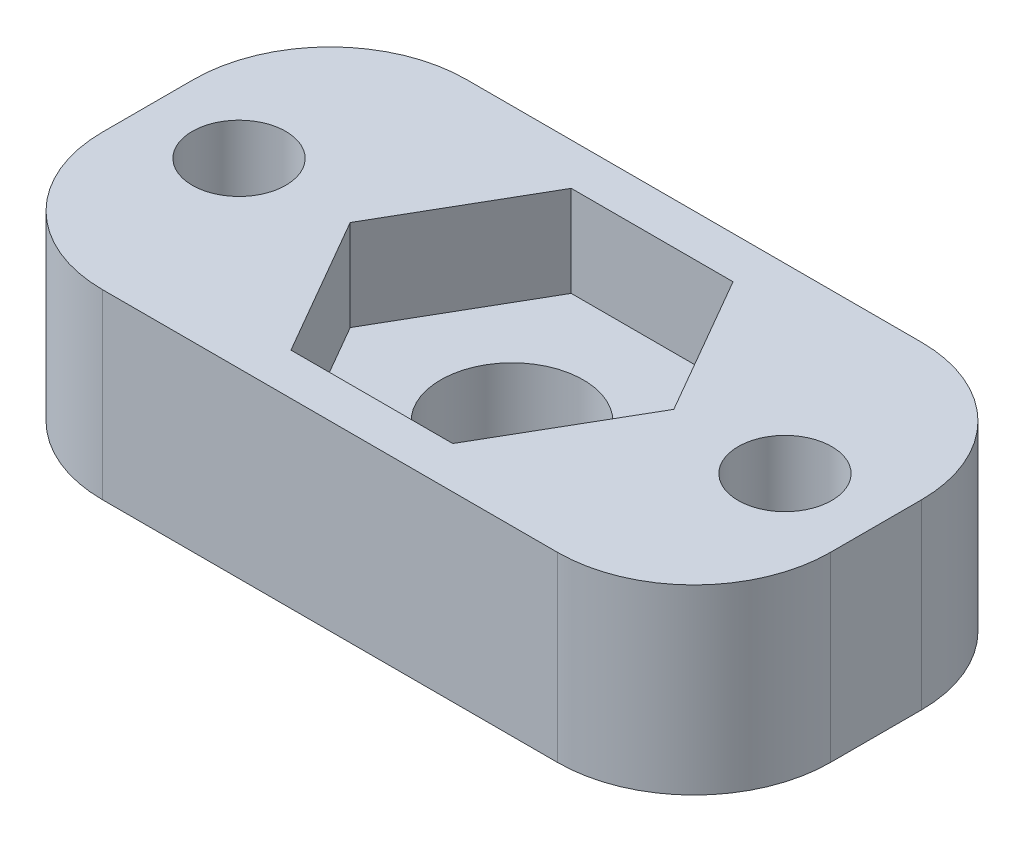
ISO-10303-21;
HEADER;
FILE_DESCRIPTION(('STEP AP214'),'2;1');
FILE_NAME('part.step','',(''),(''),'','','');
FILE_SCHEMA(('AUTOMOTIVE_DESIGN { 1 0 10303 214 1 1 1 1 }'));
ENDSEC;
DATA;
#1=APPLICATION_CONTEXT('core data for automotive mechanical design processes');
#2=APPLICATION_PROTOCOL_DEFINITION('international standard','automotive_design',2000,#1);
#3=PRODUCT_CONTEXT('',#1,'mechanical');
#4=PRODUCT('Part','Part','',(#3));
#5=PRODUCT_RELATED_PRODUCT_CATEGORY('part','',(#4));
#6=PRODUCT_DEFINITION_FORMATION('','',#4);
#7=PRODUCT_DEFINITION_CONTEXT('part definition',#1,'design');
#8=PRODUCT_DEFINITION('design','',#6,#7);
#9=PRODUCT_DEFINITION_SHAPE('','',#8);
#10=(LENGTH_UNIT() NAMED_UNIT(*) SI_UNIT(.MILLI.,.METRE.));
#11=(NAMED_UNIT(*) PLANE_ANGLE_UNIT() SI_UNIT($,.RADIAN.));
#12=(NAMED_UNIT(*) SI_UNIT($,.STERADIAN.) SOLID_ANGLE_UNIT());
#13=UNCERTAINTY_MEASURE_WITH_UNIT(LENGTH_MEASURE(1.E-05),#10,'distance_accuracy_value','');
#14=(GEOMETRIC_REPRESENTATION_CONTEXT(3) GLOBAL_UNCERTAINTY_ASSIGNED_CONTEXT((#13)) GLOBAL_UNIT_ASSIGNED_CONTEXT((#10,
#11,#12)) REPRESENTATION_CONTEXT('',''));
#15=CARTESIAN_POINT('',(0.,0.,0.));
#16=DIRECTION('',(0.,0.,1.));
#17=DIRECTION('',(1.,0.,0.));
#18=AXIS2_PLACEMENT_3D('',#15,#16,#17);
#19=CARTESIAN_POINT('',(12.7,3.175,0.));
#20=DIRECTION('',(1.,0.,0.));
#21=DIRECTION('',(0.,0.,-1.));
#22=AXIS2_PLACEMENT_3D('',#19,#20,#21);
#23=PLANE('',#22);
#24=DIRECTION('',(0.,0.,1.));
#25=VECTOR('',#24,1.);
#26=CARTESIAN_POINT('',(12.7,0.,0.));
#27=LINE('',#26,#25);
#28=CARTESIAN_POINT('',(12.7,0.,-1.5875));
#29=VERTEX_POINT('',#28);
#30=CARTESIAN_POINT('',(12.7,0.,1.5875));
#31=VERTEX_POINT('',#30);
#32=EDGE_CURVE('E240',#29,#31,#27,.T.);
#33=ORIENTED_EDGE('',*,*,#32,.F.);
#34=DIRECTION('',(0.,-1.,0.));
#35=VECTOR('',#34,1.);
#36=CARTESIAN_POINT('',(12.7,3.175,-1.5875));
#37=LINE('',#36,#35);
#38=CARTESIAN_POINT('',(12.7,6.35,-1.5875));
#39=VERTEX_POINT('',#38);
#40=EDGE_CURVE('E294',#29,#39,#37,.F.);
#41=ORIENTED_EDGE('',*,*,#40,.T.);
#42=DIRECTION('',(0.,0.,1.));
#43=VECTOR('',#42,1.);
#44=CARTESIAN_POINT('',(12.7,6.35,0.));
#45=LINE('',#44,#43);
#46=CARTESIAN_POINT('',(12.7,6.35,1.5875));
#47=VERTEX_POINT('',#46);
#48=EDGE_CURVE('E184',#39,#47,#45,.T.);
#49=ORIENTED_EDGE('',*,*,#48,.T.);
#50=DIRECTION('',(0.,-1.,0.));
#51=VECTOR('',#50,1.);
#52=CARTESIAN_POINT('',(12.7,0.,1.5875));
#53=LINE('',#52,#51);
#54=EDGE_CURVE('E290',#47,#31,#53,.T.);
#55=ORIENTED_EDGE('',*,*,#54,.T.);
#56=EDGE_LOOP('',(#33,#41,#49,#55));
#57=FACE_BOUND('',#56,.T.);
#58=ADVANCED_FACE('F43',(#57),#23,.T.);
#59=CARTESIAN_POINT('',(0.,3.175,-6.35));
#60=DIRECTION('',(0.,0.,-1.));
#61=DIRECTION('',(-1.,0.,0.));
#62=AXIS2_PLACEMENT_3D('',#59,#60,#61);
#63=PLANE('',#62);
#64=DIRECTION('',(1.,0.,0.));
#65=VECTOR('',#64,1.);
#66=CARTESIAN_POINT('',(0.,6.35,-6.35));
#67=LINE('',#66,#65);
#68=CARTESIAN_POINT('',(-7.9375,6.35,-6.35));
#69=VERTEX_POINT('',#68);
#70=CARTESIAN_POINT('',(7.9375,6.35,-6.35));
#71=VERTEX_POINT('',#70);
#72=EDGE_CURVE('E189',#69,#71,#67,.T.);
#73=ORIENTED_EDGE('',*,*,#72,.T.);
#74=DIRECTION('',(0.,-1.,0.));
#75=VECTOR('',#74,1.);
#76=CARTESIAN_POINT('',(7.9375,3.175,-6.35));
#77=LINE('',#76,#75);
#78=CARTESIAN_POINT('',(7.9375,0.,-6.35));
#79=VERTEX_POINT('',#78);
#80=EDGE_CURVE('E274',#71,#79,#77,.T.);
#81=ORIENTED_EDGE('',*,*,#80,.T.);
#82=DIRECTION('',(1.,0.,0.));
#83=VECTOR('',#82,1.);
#84=CARTESIAN_POINT('',(0.,0.,-6.35));
#85=LINE('',#84,#83);
#86=CARTESIAN_POINT('',(-7.9375,0.,-6.35));
#87=VERTEX_POINT('',#86);
#88=EDGE_CURVE('E250',#87,#79,#85,.T.);
#89=ORIENTED_EDGE('',*,*,#88,.F.);
#90=DIRECTION('',(0.,-1.,0.));
#91=VECTOR('',#90,1.);
#92=CARTESIAN_POINT('',(-7.9375,6.35,-6.35));
#93=LINE('',#92,#91);
#94=EDGE_CURVE('E245',#87,#69,#93,.F.);
#95=ORIENTED_EDGE('',*,*,#94,.T.);
#96=EDGE_LOOP('',(#73,#81,#89,#95));
#97=FACE_BOUND('',#96,.T.);
#98=ADVANCED_FACE('F361',(#97),#63,.T.);
#99=CARTESIAN_POINT('',(-12.7,3.175,0.));
#100=DIRECTION('',(1.,0.,0.));
#101=DIRECTION('',(0.,0.,-1.));
#102=AXIS2_PLACEMENT_3D('',#99,#100,#101);
#103=PLANE('',#102);
#104=DIRECTION('',(0.,0.,1.));
#105=VECTOR('',#104,1.);
#106=CARTESIAN_POINT('',(-12.7,6.35,0.));
#107=LINE('',#106,#105);
#108=CARTESIAN_POINT('',(-12.7,6.35,-1.5875));
#109=VERTEX_POINT('',#108);
#110=CARTESIAN_POINT('',(-12.7,6.35,1.5875));
#111=VERTEX_POINT('',#110);
#112=EDGE_CURVE('E170',#109,#111,#107,.T.);
#113=ORIENTED_EDGE('',*,*,#112,.F.);
#114=DIRECTION('',(0.,-1.,0.));
#115=VECTOR('',#114,1.);
#116=CARTESIAN_POINT('',(-12.7,0.,-1.5875));
#117=LINE('',#116,#115);
#118=CARTESIAN_POINT('',(-12.7,0.,-1.5875));
#119=VERTEX_POINT('',#118);
#120=EDGE_CURVE('E12',#109,#119,#117,.T.);
#121=ORIENTED_EDGE('',*,*,#120,.T.);
#122=DIRECTION('',(0.,0.,1.));
#123=VECTOR('',#122,1.);
#124=CARTESIAN_POINT('',(-12.7,0.,0.));
#125=LINE('',#124,#123);
#126=CARTESIAN_POINT('',(-12.7,0.,1.5875));
#127=VERTEX_POINT('',#126);
#128=EDGE_CURVE('E254',#119,#127,#125,.T.);
#129=ORIENTED_EDGE('',*,*,#128,.T.);
#130=DIRECTION('',(0.,-1.,0.));
#131=VECTOR('',#130,1.);
#132=CARTESIAN_POINT('',(-12.7,3.175,1.5875));
#133=LINE('',#132,#131);
#134=EDGE_CURVE('E52',#127,#111,#133,.F.);
#135=ORIENTED_EDGE('',*,*,#134,.T.);
#136=EDGE_LOOP('',(#113,#121,#129,#135));
#137=FACE_BOUND('',#136,.T.);
#138=ADVANCED_FACE('F317',(#137),#103,.F.);
#139=CARTESIAN_POINT('',(-9.525,3.175,0.));
#140=DIRECTION('',(0.,-1.,0.));
#141=DIRECTION('',(0.,0.,-1.));
#142=AXIS2_PLACEMENT_3D('',#139,#140,#141);
#143=CYLINDRICAL_SURFACE('',#142,1.63195);
#144=CARTESIAN_POINT('',(-9.525,0.,0.));
#145=DIRECTION('',(0.,1.,0.));
#146=DIRECTION('',(0.,0.,1.));
#147=AXIS2_PLACEMENT_3D('',#144,#145,#146);
#148=CIRCLE('',#147,1.63195);
#149=CARTESIAN_POINT('',(-9.525,0.,1.63195));
#150=VERTEX_POINT('',#149);
#151=EDGE_CURVE('E265',#150,#150,#148,.F.);
#152=ORIENTED_EDGE('',*,*,#151,.T.);
#153=EDGE_LOOP('',(#152));
#154=FACE_BOUND('',#153,.T.);
#155=CARTESIAN_POINT('',(-9.525,6.35,0.));
#156=DIRECTION('',(0.,1.,0.));
#157=DIRECTION('',(0.,0.,1.));
#158=AXIS2_PLACEMENT_3D('',#155,#156,#157);
#159=CIRCLE('',#158,1.63195);
#160=CARTESIAN_POINT('',(-9.525,6.35,1.63195));
#161=VERTEX_POINT('',#160);
#162=EDGE_CURVE('E205',#161,#161,#159,.F.);
#163=ORIENTED_EDGE('',*,*,#162,.F.);
#164=EDGE_LOOP('',(#163));
#165=FACE_BOUND('',#164,.T.);
#166=ADVANCED_FACE('F350',(#154,#165),#143,.F.);
#167=CARTESIAN_POINT('',(9.525,3.175,0.));
#168=DIRECTION('',(0.,-1.,0.));
#169=DIRECTION('',(0.,0.,-1.));
#170=AXIS2_PLACEMENT_3D('',#167,#168,#169);
#171=CYLINDRICAL_SURFACE('',#170,1.63195);
#172=CARTESIAN_POINT('',(9.525,0.,0.));
#173=DIRECTION('',(0.,1.,0.));
#174=DIRECTION('',(0.,0.,1.));
#175=AXIS2_PLACEMENT_3D('',#172,#173,#174);
#176=CIRCLE('',#175,1.63195);
#177=CARTESIAN_POINT('',(9.525,0.,1.63195));
#178=VERTEX_POINT('',#177);
#179=EDGE_CURVE('E261',#178,#178,#176,.T.);
#180=ORIENTED_EDGE('',*,*,#179,.F.);
#181=EDGE_LOOP('',(#180));
#182=FACE_BOUND('',#181,.T.);
#183=CARTESIAN_POINT('',(9.525,6.35,0.));
#184=DIRECTION('',(0.,1.,0.));
#185=DIRECTION('',(0.,0.,1.));
#186=AXIS2_PLACEMENT_3D('',#183,#184,#185);
#187=CIRCLE('',#186,1.63195);
#188=CARTESIAN_POINT('',(9.525,6.35,1.63195));
#189=VERTEX_POINT('',#188);
#190=EDGE_CURVE('E177',#189,#189,#187,.T.);
#191=ORIENTED_EDGE('',*,*,#190,.T.);
#192=EDGE_LOOP('',(#191));
#193=FACE_BOUND('',#192,.T.);
#194=ADVANCED_FACE('F352',(#182,#193),#171,.F.);
#195=CARTESIAN_POINT('',(0.,3.175,6.35));
#196=DIRECTION('',(0.,0.,-1.));
#197=DIRECTION('',(-1.,0.,0.));
#198=AXIS2_PLACEMENT_3D('',#195,#196,#197);
#199=PLANE('',#198);
#200=DIRECTION('',(1.,0.,0.));
#201=VECTOR('',#200,1.);
#202=CARTESIAN_POINT('',(0.,0.,6.35));
#203=LINE('',#202,#201);
#204=CARTESIAN_POINT('',(-7.9375,0.,6.35));
#205=VERTEX_POINT('',#204);
#206=CARTESIAN_POINT('',(7.9375,0.,6.35));
#207=VERTEX_POINT('',#206);
#208=EDGE_CURVE('E258',#205,#207,#203,.T.);
#209=ORIENTED_EDGE('',*,*,#208,.T.);
#210=DIRECTION('',(0.,-1.,0.));
#211=VECTOR('',#210,1.);
#212=CARTESIAN_POINT('',(7.9375,6.35,6.35));
#213=LINE('',#212,#211);
#214=CARTESIAN_POINT('',(7.9375,6.35,6.35));
#215=VERTEX_POINT('',#214);
#216=EDGE_CURVE('E59',#207,#215,#213,.F.);
#217=ORIENTED_EDGE('',*,*,#216,.T.);
#218=DIRECTION('',(1.,0.,0.));
#219=VECTOR('',#218,1.);
#220=CARTESIAN_POINT('',(0.,6.35,6.35));
#221=LINE('',#220,#219);
#222=CARTESIAN_POINT('',(-7.9375,6.35,6.35));
#223=VERTEX_POINT('',#222);
#224=EDGE_CURVE('E202',#223,#215,#221,.T.);
#225=ORIENTED_EDGE('',*,*,#224,.F.);
#226=DIRECTION('',(0.,-1.,0.));
#227=VECTOR('',#226,1.);
#228=CARTESIAN_POINT('',(-7.9375,3.175,6.35));
#229=LINE('',#228,#227);
#230=EDGE_CURVE('E308',#223,#205,#229,.T.);
#231=ORIENTED_EDGE('',*,*,#230,.T.);
#232=EDGE_LOOP('',(#209,#217,#225,#231));
#233=FACE_BOUND('',#232,.T.);
#234=ADVANCED_FACE('F328',(#233),#199,.F.);
#235=CARTESIAN_POINT('',(0.,3.175,0.));
#236=DIRECTION('',(0.,-1.,0.));
#237=DIRECTION('',(0.,0.,-1.));
#238=AXIS2_PLACEMENT_3D('',#235,#236,#237);
#239=CYLINDRICAL_SURFACE('',#238,2.4892);
#240=CARTESIAN_POINT('',(0.,3.175,0.));
#241=DIRECTION('',(0.,1.,0.));
#242=DIRECTION('',(0.,0.,1.));
#243=AXIS2_PLACEMENT_3D('',#240,#241,#242);
#244=CIRCLE('',#243,2.4892);
#245=CARTESIAN_POINT('',(0.,3.175,2.4892));
#246=VERTEX_POINT('',#245);
#247=EDGE_CURVE('E241',#246,#246,#244,.T.);
#248=ORIENTED_EDGE('',*,*,#247,.T.);
#249=EDGE_LOOP('',(#248));
#250=FACE_BOUND('',#249,.T.);
#251=CARTESIAN_POINT('',(0.,0.,0.));
#252=DIRECTION('',(0.,1.,0.));
#253=DIRECTION('',(0.,0.,1.));
#254=AXIS2_PLACEMENT_3D('',#251,#252,#253);
#255=CIRCLE('',#254,2.4892);
#256=CARTESIAN_POINT('',(0.,0.,2.4892));
#257=VERTEX_POINT('',#256);
#258=EDGE_CURVE('E246',#257,#257,#255,.T.);
#259=ORIENTED_EDGE('',*,*,#258,.F.);
#260=EDGE_LOOP('',(#259));
#261=FACE_BOUND('',#260,.T.);
#262=ADVANCED_FACE('F437',(#250,#261),#239,.F.);
#263=CARTESIAN_POINT('',(0.,3.175,0.));
#264=DIRECTION('',(0.,1.,0.));
#265=DIRECTION('',(0.,0.,1.));
#266=AXIS2_PLACEMENT_3D('',#263,#264,#265);
#267=PLANE('',#266);
#268=DIRECTION('',(-0.5,0.,0.866025403784439));
#269=VECTOR('',#268,1.);
#270=CARTESIAN_POINT('',(4.23443121180401,3.175,2.44475));
#271=LINE('',#270,#269);
#272=CARTESIAN_POINT('',(5.64590828240535,3.175,0.));
#273=VERTEX_POINT('',#272);
#274=CARTESIAN_POINT('',(2.82295414120267,3.175,4.8895));
#275=VERTEX_POINT('',#274);
#276=EDGE_CURVE('E236',#273,#275,#271,.T.);
#277=ORIENTED_EDGE('',*,*,#276,.F.);
#278=DIRECTION('',(0.5,0.,0.866025403784439));
#279=VECTOR('',#278,1.);
#280=CARTESIAN_POINT('',(4.23443121180401,3.175,-2.44475));
#281=LINE('',#280,#279);
#282=CARTESIAN_POINT('',(2.82295414120267,3.175,-4.8895));
#283=VERTEX_POINT('',#282);
#284=EDGE_CURVE('E219',#283,#273,#281,.T.);
#285=ORIENTED_EDGE('',*,*,#284,.F.);
#286=DIRECTION('',(1.,0.,0.));
#287=VECTOR('',#286,1.);
#288=CARTESIAN_POINT('',(0.,3.175,-4.8895));
#289=LINE('',#288,#287);
#290=CARTESIAN_POINT('',(-2.82295414120267,3.175,-4.8895));
#291=VERTEX_POINT('',#290);
#292=EDGE_CURVE('E166',#291,#283,#289,.T.);
#293=ORIENTED_EDGE('',*,*,#292,.F.);
#294=DIRECTION('',(0.5,0.,-0.866025403784439));
#295=VECTOR('',#294,1.);
#296=CARTESIAN_POINT('',(-4.23443121180401,3.175,-2.44475));
#297=LINE('',#296,#295);
#298=CARTESIAN_POINT('',(-5.64590828240535,3.175,0.));
#299=VERTEX_POINT('',#298);
#300=EDGE_CURVE('E224',#299,#291,#297,.T.);
#301=ORIENTED_EDGE('',*,*,#300,.F.);
#302=DIRECTION('',(-0.5,0.,-0.866025403784439));
#303=VECTOR('',#302,1.);
#304=CARTESIAN_POINT('',(-4.23443121180402,3.175,2.44475));
#305=LINE('',#304,#303);
#306=CARTESIAN_POINT('',(-2.82295414120268,3.175,4.8895));
#307=VERTEX_POINT('',#306);
#308=EDGE_CURVE('E228',#307,#299,#305,.T.);
#309=ORIENTED_EDGE('',*,*,#308,.F.);
#310=DIRECTION('',(-1.,0.,0.));
#311=VECTOR('',#310,1.);
#312=CARTESIAN_POINT('',(0.,3.175,4.8895));
#313=LINE('',#312,#311);
#314=EDGE_CURVE('E232',#275,#307,#313,.T.);
#315=ORIENTED_EDGE('',*,*,#314,.F.);
#316=EDGE_LOOP('',(#277,#285,#293,#301,#309,#315));
#317=FACE_BOUND('',#316,.T.);
#318=ORIENTED_EDGE('',*,*,#247,.F.);
#319=EDGE_LOOP('',(#318));
#320=FACE_BOUND('',#319,.T.);
#321=ADVANCED_FACE('F423',(#317,#320),#267,.T.);
#322=CARTESIAN_POINT('',(0.,0.,0.));
#323=DIRECTION('',(0.,1.,0.));
#324=DIRECTION('',(0.,0.,1.));
#325=AXIS2_PLACEMENT_3D('',#322,#323,#324);
#326=PLANE('',#325);
#327=ORIENTED_EDGE('',*,*,#258,.T.);
#328=EDGE_LOOP('',(#327));
#329=FACE_BOUND('',#328,.T.);
#330=ORIENTED_EDGE('',*,*,#151,.F.);
#331=EDGE_LOOP('',(#330));
#332=FACE_BOUND('',#331,.T.);
#333=ORIENTED_EDGE('',*,*,#179,.T.);
#334=EDGE_LOOP('',(#333));
#335=FACE_BOUND('',#334,.T.);
#336=ORIENTED_EDGE('',*,*,#88,.T.);
#337=CARTESIAN_POINT('',(7.9375,0.,-1.5875));
#338=DIRECTION('',(0.,1.,0.));
#339=DIRECTION('',(0.,0.,1.));
#340=AXIS2_PLACEMENT_3D('',#337,#338,#339);
#341=CIRCLE('',#340,4.7625);
#342=EDGE_CURVE('E287',#79,#29,#341,.F.);
#343=ORIENTED_EDGE('',*,*,#342,.T.);
#344=ORIENTED_EDGE('',*,*,#32,.T.);
#345=CARTESIAN_POINT('',(7.9375,0.,1.5875));
#346=DIRECTION('',(0.,1.,0.));
#347=DIRECTION('',(0.,0.,1.));
#348=AXIS2_PLACEMENT_3D('',#345,#346,#347);
#349=CIRCLE('',#348,4.7625);
#350=EDGE_CURVE('E284',#31,#207,#349,.F.);
#351=ORIENTED_EDGE('',*,*,#350,.T.);
#352=ORIENTED_EDGE('',*,*,#208,.F.);
#353=CARTESIAN_POINT('',(-7.9375,0.,1.5875));
#354=DIRECTION('',(0.,1.,0.));
#355=DIRECTION('',(0.,0.,1.));
#356=AXIS2_PLACEMENT_3D('',#353,#354,#355);
#357=CIRCLE('',#356,4.7625);
#358=EDGE_CURVE('E278',#205,#127,#357,.F.);
#359=ORIENTED_EDGE('',*,*,#358,.T.);
#360=ORIENTED_EDGE('',*,*,#128,.F.);
#361=CARTESIAN_POINT('',(-7.9375,0.,-1.5875));
#362=DIRECTION('',(0.,1.,0.));
#363=DIRECTION('',(0.,0.,1.));
#364=AXIS2_PLACEMENT_3D('',#361,#362,#363);
#365=CIRCLE('',#364,4.7625);
#366=EDGE_CURVE('E281',#119,#87,#365,.F.);
#367=ORIENTED_EDGE('',*,*,#366,.T.);
#368=EDGE_LOOP('',(#336,#343,#344,#351,#352,#359,#360,#367));
#369=FACE_BOUND('',#368,.T.);
#370=ADVANCED_FACE('F330',(#329,#332,#335,#369),#326,.F.);
#371=CARTESIAN_POINT('',(4.23443121180401,37.9230633142473,2.44475));
#372=DIRECTION('',(-0.866025403784438,0.,-0.5));
#373=DIRECTION('',(-0.5,0.,0.866025403784439));
#374=AXIS2_PLACEMENT_3D('',#371,#372,#373);
#375=PLANE('',#374);
#376=DIRECTION('',(0.,-1.,0.));
#377=VECTOR('',#376,1.);
#378=CARTESIAN_POINT('',(5.64590828240535,37.9230633142473,0.));
#379=LINE('',#378,#377);
#380=CARTESIAN_POINT('',(5.64590828240535,6.35,0.));
#381=VERTEX_POINT('',#380);
#382=EDGE_CURVE('E175',#381,#273,#379,.T.);
#383=ORIENTED_EDGE('',*,*,#382,.T.);
#384=ORIENTED_EDGE('',*,*,#276,.T.);
#385=DIRECTION('',(0.,-1.,0.));
#386=VECTOR('',#385,1.);
#387=CARTESIAN_POINT('',(2.82295414120267,37.9230633142473,4.8895));
#388=LINE('',#387,#386);
#389=CARTESIAN_POINT('',(2.82295414120267,6.35,4.8895));
#390=VERTEX_POINT('',#389);
#391=EDGE_CURVE('E194',#390,#275,#388,.T.);
#392=ORIENTED_EDGE('',*,*,#391,.F.);
#393=DIRECTION('',(0.5,0.,-0.866025403784439));
#394=VECTOR('',#393,1.);
#395=CARTESIAN_POINT('',(4.23443121180401,6.35,2.44475));
#396=LINE('',#395,#394);
#397=EDGE_CURVE('E186',#390,#381,#396,.T.);
#398=ORIENTED_EDGE('',*,*,#397,.T.);
#399=EDGE_LOOP('',(#383,#384,#392,#398));
#400=FACE_BOUND('',#399,.T.);
#401=ADVANCED_FACE('F422',(#400),#375,.T.);
#402=CARTESIAN_POINT('',(0.,37.9230633142473,4.8895));
#403=DIRECTION('',(0.,0.,-1.));
#404=DIRECTION('',(-1.,0.,0.));
#405=AXIS2_PLACEMENT_3D('',#402,#403,#404);
#406=PLANE('',#405);
#407=ORIENTED_EDGE('',*,*,#391,.T.);
#408=ORIENTED_EDGE('',*,*,#314,.T.);
#409=DIRECTION('',(0.,-1.,0.));
#410=VECTOR('',#409,1.);
#411=CARTESIAN_POINT('',(-2.82295414120268,37.9230633142473,4.8895));
#412=LINE('',#411,#410);
#413=CARTESIAN_POINT('',(-2.82295414120268,6.35,4.8895));
#414=VERTEX_POINT('',#413);
#415=EDGE_CURVE('E199',#414,#307,#412,.T.);
#416=ORIENTED_EDGE('',*,*,#415,.F.);
#417=DIRECTION('',(1.,0.,0.));
#418=VECTOR('',#417,1.);
#419=CARTESIAN_POINT('',(0.,6.35,4.8895));
#420=LINE('',#419,#418);
#421=EDGE_CURVE('E190',#414,#390,#420,.T.);
#422=ORIENTED_EDGE('',*,*,#421,.T.);
#423=EDGE_LOOP('',(#407,#408,#416,#422));
#424=FACE_BOUND('',#423,.T.);
#425=ADVANCED_FACE('F494',(#424),#406,.T.);
#426=CARTESIAN_POINT('',(-4.23443121180402,37.9230633142473,2.44475));
#427=DIRECTION('',(0.866025403784439,0.,-0.5));
#428=DIRECTION('',(-0.5,0.,-0.866025403784439));
#429=AXIS2_PLACEMENT_3D('',#426,#427,#428);
#430=PLANE('',#429);
#431=ORIENTED_EDGE('',*,*,#415,.T.);
#432=ORIENTED_EDGE('',*,*,#308,.T.);
#433=DIRECTION('',(0.,-1.,0.));
#434=VECTOR('',#433,1.);
#435=CARTESIAN_POINT('',(-5.64590828240535,37.9230633142473,0.));
#436=LINE('',#435,#434);
#437=CARTESIAN_POINT('',(-5.64590828240535,6.35,0.));
#438=VERTEX_POINT('',#437);
#439=EDGE_CURVE('E160',#438,#299,#436,.T.);
#440=ORIENTED_EDGE('',*,*,#439,.F.);
#441=DIRECTION('',(0.5,0.,0.866025403784439));
#442=VECTOR('',#441,1.);
#443=CARTESIAN_POINT('',(-4.23443121180402,6.35,2.44475));
#444=LINE('',#443,#442);
#445=EDGE_CURVE('E195',#438,#414,#444,.T.);
#446=ORIENTED_EDGE('',*,*,#445,.T.);
#447=EDGE_LOOP('',(#431,#432,#440,#446));
#448=FACE_BOUND('',#447,.T.);
#449=ADVANCED_FACE('F484',(#448),#430,.T.);
#450=CARTESIAN_POINT('',(-4.23443121180401,37.9230633142473,-2.44475));
#451=DIRECTION('',(0.866025403784439,0.,0.5));
#452=DIRECTION('',(0.5,0.,-0.866025403784439));
#453=AXIS2_PLACEMENT_3D('',#450,#451,#452);
#454=PLANE('',#453);
#455=ORIENTED_EDGE('',*,*,#439,.T.);
#456=ORIENTED_EDGE('',*,*,#300,.T.);
#457=DIRECTION('',(0.,-1.,0.));
#458=VECTOR('',#457,1.);
#459=CARTESIAN_POINT('',(-2.82295414120267,37.9230633142473,-4.8895));
#460=LINE('',#459,#458);
#461=CARTESIAN_POINT('',(-2.82295414120267,6.35,-4.8895));
#462=VERTEX_POINT('',#461);
#463=EDGE_CURVE('E159',#462,#291,#460,.T.);
#464=ORIENTED_EDGE('',*,*,#463,.F.);
#465=DIRECTION('',(-0.5,0.,0.866025403784439));
#466=VECTOR('',#465,1.);
#467=CARTESIAN_POINT('',(-4.23443121180401,6.35,-2.44475));
#468=LINE('',#467,#466);
#469=EDGE_CURVE('E154',#462,#438,#468,.T.);
#470=ORIENTED_EDGE('',*,*,#469,.T.);
#471=EDGE_LOOP('',(#455,#456,#464,#470));
#472=FACE_BOUND('',#471,.T.);
#473=ADVANCED_FACE('F475',(#472),#454,.T.);
#474=CARTESIAN_POINT('',(0.,37.9230633142473,-4.8895));
#475=DIRECTION('',(0.,0.,1.));
#476=DIRECTION('',(1.,0.,0.));
#477=AXIS2_PLACEMENT_3D('',#474,#475,#476);
#478=PLANE('',#477);
#479=ORIENTED_EDGE('',*,*,#463,.T.);
#480=ORIENTED_EDGE('',*,*,#292,.T.);
#481=DIRECTION('',(0.,-1.,0.));
#482=VECTOR('',#481,1.);
#483=CARTESIAN_POINT('',(2.82295414120267,37.9230633142473,-4.8895));
#484=LINE('',#483,#482);
#485=CARTESIAN_POINT('',(2.82295414120267,6.35,-4.8895));
#486=VERTEX_POINT('',#485);
#487=EDGE_CURVE('E164',#486,#283,#484,.T.);
#488=ORIENTED_EDGE('',*,*,#487,.F.);
#489=DIRECTION('',(-1.,0.,0.));
#490=VECTOR('',#489,1.);
#491=CARTESIAN_POINT('',(0.,6.35,-4.8895));
#492=LINE('',#491,#490);
#493=EDGE_CURVE('E146',#486,#462,#492,.T.);
#494=ORIENTED_EDGE('',*,*,#493,.T.);
#495=EDGE_LOOP('',(#479,#480,#488,#494));
#496=FACE_BOUND('',#495,.T.);
#497=ADVANCED_FACE('F165',(#496),#478,.T.);
#498=CARTESIAN_POINT('',(4.23443121180401,37.9230633142473,-2.44475));
#499=DIRECTION('',(-0.866025403784439,0.,0.5));
#500=DIRECTION('',(0.5,0.,0.866025403784439));
#501=AXIS2_PLACEMENT_3D('',#498,#499,#500);
#502=PLANE('',#501);
#503=ORIENTED_EDGE('',*,*,#487,.T.);
#504=ORIENTED_EDGE('',*,*,#284,.T.);
#505=ORIENTED_EDGE('',*,*,#382,.F.);
#506=DIRECTION('',(-0.5,0.,-0.866025403784439));
#507=VECTOR('',#506,1.);
#508=CARTESIAN_POINT('',(4.23443121180401,6.35,-2.44475));
#509=LINE('',#508,#507);
#510=EDGE_CURVE('E151',#381,#486,#509,.T.);
#511=ORIENTED_EDGE('',*,*,#510,.T.);
#512=EDGE_LOOP('',(#503,#504,#505,#511));
#513=FACE_BOUND('',#512,.T.);
#514=ADVANCED_FACE('F173',(#513),#502,.T.);
#515=CARTESIAN_POINT('',(0.,6.35,0.));
#516=DIRECTION('',(0.,1.,0.));
#517=DIRECTION('',(0.,0.,1.));
#518=AXIS2_PLACEMENT_3D('',#515,#516,#517);
#519=PLANE('',#518);
#520=ORIENTED_EDGE('',*,*,#190,.F.);
#521=EDGE_LOOP('',(#520));
#522=FACE_BOUND('',#521,.T.);
#523=ORIENTED_EDGE('',*,*,#48,.F.);
#524=CARTESIAN_POINT('',(7.9375,6.35,-1.5875));
#525=DIRECTION('',(0.,1.,0.));
#526=DIRECTION('',(0.,0.,1.));
#527=AXIS2_PLACEMENT_3D('',#524,#525,#526);
#528=CIRCLE('',#527,4.7625);
#529=EDGE_CURVE('E305',#39,#71,#528,.T.);
#530=ORIENTED_EDGE('',*,*,#529,.T.);
#531=ORIENTED_EDGE('',*,*,#72,.F.);
#532=CARTESIAN_POINT('',(-7.9375,6.35,-1.5875));
#533=DIRECTION('',(0.,1.,0.));
#534=DIRECTION('',(0.,0.,1.));
#535=AXIS2_PLACEMENT_3D('',#532,#533,#534);
#536=CIRCLE('',#535,4.7625);
#537=EDGE_CURVE('E299',#69,#109,#536,.T.);
#538=ORIENTED_EDGE('',*,*,#537,.T.);
#539=ORIENTED_EDGE('',*,*,#112,.T.);
#540=CARTESIAN_POINT('',(-7.9375,6.35,1.5875));
#541=DIRECTION('',(0.,1.,0.));
#542=DIRECTION('',(0.,0.,1.));
#543=AXIS2_PLACEMENT_3D('',#540,#541,#542);
#544=CIRCLE('',#543,4.7625);
#545=EDGE_CURVE('E66',#111,#223,#544,.T.);
#546=ORIENTED_EDGE('',*,*,#545,.T.);
#547=ORIENTED_EDGE('',*,*,#224,.T.);
#548=CARTESIAN_POINT('',(7.9375,6.35,1.5875));
#549=DIRECTION('',(0.,1.,0.));
#550=DIRECTION('',(0.,0.,1.));
#551=AXIS2_PLACEMENT_3D('',#548,#549,#550);
#552=CIRCLE('',#551,4.7625);
#553=EDGE_CURVE('E302',#215,#47,#552,.T.);
#554=ORIENTED_EDGE('',*,*,#553,.T.);
#555=EDGE_LOOP('',(#523,#530,#531,#538,#539,#546,#547,#554));
#556=FACE_BOUND('',#555,.T.);
#557=ORIENTED_EDGE('',*,*,#397,.F.);
#558=ORIENTED_EDGE('',*,*,#421,.F.);
#559=ORIENTED_EDGE('',*,*,#445,.F.);
#560=ORIENTED_EDGE('',*,*,#469,.F.);
#561=ORIENTED_EDGE('',*,*,#493,.F.);
#562=ORIENTED_EDGE('',*,*,#510,.F.);
#563=EDGE_LOOP('',(#557,#558,#559,#560,#561,#562));
#564=FACE_BOUND('',#563,.T.);
#565=ORIENTED_EDGE('',*,*,#162,.T.);
#566=EDGE_LOOP('',(#565));
#567=FACE_BOUND('',#566,.T.);
#568=ADVANCED_FACE('F148',(#522,#556,#564,#567),#519,.T.);
#569=CARTESIAN_POINT('',(7.9375,3.175,-1.5875));
#570=DIRECTION('',(0.,-1.,0.));
#571=DIRECTION('',(0.,0.,-1.));
#572=AXIS2_PLACEMENT_3D('',#569,#570,#571);
#573=CYLINDRICAL_SURFACE('',#572,4.7625);
#574=ORIENTED_EDGE('',*,*,#529,.F.);
#575=ORIENTED_EDGE('',*,*,#40,.F.);
#576=ORIENTED_EDGE('',*,*,#342,.F.);
#577=ORIENTED_EDGE('',*,*,#80,.F.);
#578=EDGE_LOOP('',(#574,#575,#576,#577));
#579=FACE_BOUND('',#578,.T.);
#580=ADVANCED_FACE('F371',(#579),#573,.T.);
#581=CARTESIAN_POINT('',(7.9375,3.175,1.5875));
#582=DIRECTION('',(0.,1.,0.));
#583=DIRECTION('',(0.,0.,1.));
#584=AXIS2_PLACEMENT_3D('',#581,#582,#583);
#585=CYLINDRICAL_SURFACE('',#584,4.7625);
#586=ORIENTED_EDGE('',*,*,#553,.F.);
#587=ORIENTED_EDGE('',*,*,#216,.F.);
#588=ORIENTED_EDGE('',*,*,#350,.F.);
#589=ORIENTED_EDGE('',*,*,#54,.F.);
#590=EDGE_LOOP('',(#586,#587,#588,#589));
#591=FACE_BOUND('',#590,.T.);
#592=ADVANCED_FACE('F335',(#591),#585,.T.);
#593=CARTESIAN_POINT('',(-7.9375,3.175,-1.5875));
#594=DIRECTION('',(0.,1.,0.));
#595=DIRECTION('',(0.,0.,1.));
#596=AXIS2_PLACEMENT_3D('',#593,#594,#595);
#597=CYLINDRICAL_SURFACE('',#596,4.7625);
#598=ORIENTED_EDGE('',*,*,#537,.F.);
#599=ORIENTED_EDGE('',*,*,#94,.F.);
#600=ORIENTED_EDGE('',*,*,#366,.F.);
#601=ORIENTED_EDGE('',*,*,#120,.F.);
#602=EDGE_LOOP('',(#598,#599,#600,#601));
#603=FACE_BOUND('',#602,.T.);
#604=ADVANCED_FACE('F376',(#603),#597,.T.);
#605=CARTESIAN_POINT('',(-7.9375,3.175,1.5875));
#606=DIRECTION('',(0.,-1.,0.));
#607=DIRECTION('',(0.,0.,-1.));
#608=AXIS2_PLACEMENT_3D('',#605,#606,#607);
#609=CYLINDRICAL_SURFACE('',#608,4.7625);
#610=ORIENTED_EDGE('',*,*,#545,.F.);
#611=ORIENTED_EDGE('',*,*,#134,.F.);
#612=ORIENTED_EDGE('',*,*,#358,.F.);
#613=ORIENTED_EDGE('',*,*,#230,.F.);
#614=EDGE_LOOP('',(#610,#611,#612,#613));
#615=FACE_BOUND('',#614,.T.);
#616=ADVANCED_FACE('F45',(#615),#609,.T.);
#617=CLOSED_SHELL('',(#58,#98,#138,#166,#194,#234,#262,#321,#370,#401,#425,#449,#473,#497,#514,
#568,#580,#592,#604,#616));
#618=MANIFOLD_SOLID_BREP('B2',#617);
#619=ADVANCED_BREP_SHAPE_REPRESENTATION('',(#18,#618),#14);
#620=SHAPE_DEFINITION_REPRESENTATION(#9,#619);
ENDSEC;
END-ISO-10303-21;
